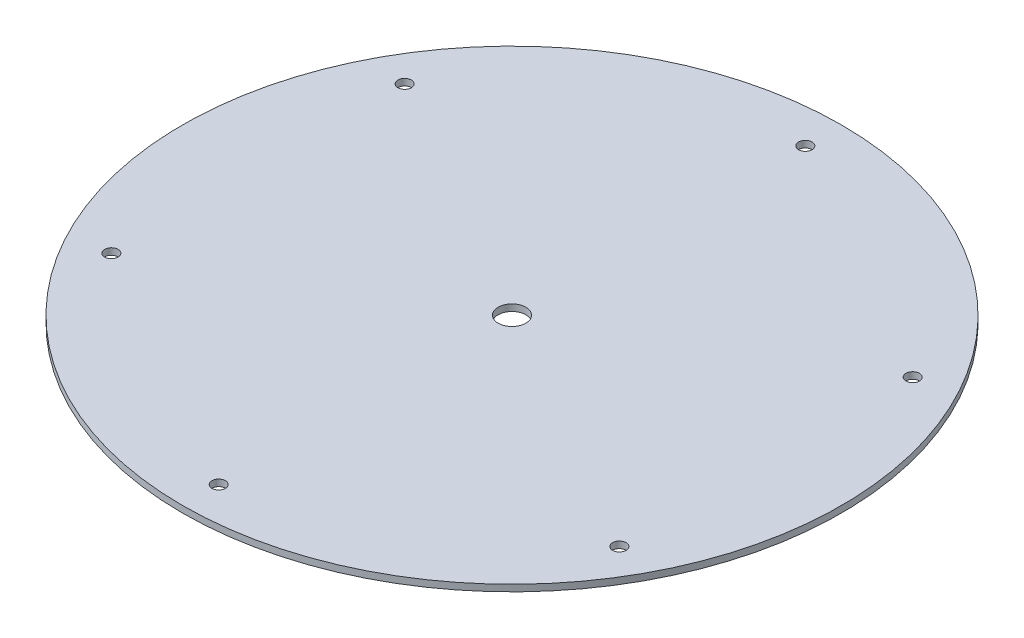
ISO-10303-21;
HEADER;
FILE_DESCRIPTION(('STEP AP214'),'2;1');
FILE_NAME('part.step','',(''),(''),'','','');
FILE_SCHEMA(('AUTOMOTIVE_DESIGN { 1 0 10303 214 1 1 1 1 }'));
ENDSEC;
DATA;
#1=APPLICATION_CONTEXT('core data for automotive mechanical design processes');
#2=APPLICATION_PROTOCOL_DEFINITION('international standard','automotive_design',2000,#1);
#3=PRODUCT_CONTEXT('',#1,'mechanical');
#4=PRODUCT('Part','Part','',(#3));
#5=PRODUCT_RELATED_PRODUCT_CATEGORY('part','',(#4));
#6=PRODUCT_DEFINITION_FORMATION('','',#4);
#7=PRODUCT_DEFINITION_CONTEXT('part definition',#1,'design');
#8=PRODUCT_DEFINITION('design','',#6,#7);
#9=PRODUCT_DEFINITION_SHAPE('','',#8);
#10=(LENGTH_UNIT() NAMED_UNIT(*) SI_UNIT(.MILLI.,.METRE.));
#11=(NAMED_UNIT(*) PLANE_ANGLE_UNIT() SI_UNIT($,.RADIAN.));
#12=(NAMED_UNIT(*) SI_UNIT($,.STERADIAN.) SOLID_ANGLE_UNIT());
#13=UNCERTAINTY_MEASURE_WITH_UNIT(LENGTH_MEASURE(1.E-05),#10,'distance_accuracy_value','');
#14=(GEOMETRIC_REPRESENTATION_CONTEXT(3) GLOBAL_UNCERTAINTY_ASSIGNED_CONTEXT((#13)) GLOBAL_UNIT_ASSIGNED_CONTEXT((#10,
#11,#12)) REPRESENTATION_CONTEXT('',''));
#15=CARTESIAN_POINT('',(0.,0.,0.));
#16=DIRECTION('',(0.,0.,1.));
#17=DIRECTION('',(1.,0.,0.));
#18=AXIS2_PLACEMENT_3D('',#15,#16,#17);
#19=CARTESIAN_POINT('',(0.,2.5,0.));
#20=DIRECTION('',(0.,1.,0.));
#21=DIRECTION('',(0.,0.,1.));
#22=AXIS2_PLACEMENT_3D('',#19,#20,#21);
#23=PLANE('',#22);
#24=CARTESIAN_POINT('',(-192.690652342028,2.5,-111.249999999994));
#25=DIRECTION('',(0.,1.,0.));
#26=DIRECTION('',(0.,0.,1.));
#27=AXIS2_PLACEMENT_3D('',#24,#25,#26);
#28=CIRCLE('',#27,5.09999999999998);
#29=CARTESIAN_POINT('',(-192.690652342028,2.5,-106.149999999994));
#30=VERTEX_POINT('',#29);
#31=EDGE_CURVE('E70',#30,#30,#28,.T.);
#32=ORIENTED_EDGE('',*,*,#31,.F.);
#33=EDGE_LOOP('',(#32));
#34=FACE_BOUND('',#33,.T.);
#35=CARTESIAN_POINT('',(1.90398786258418E-11,2.5,222.499999999989));
#36=DIRECTION('',(0.,1.,0.));
#37=DIRECTION('',(0.,0.,1.));
#38=AXIS2_PLACEMENT_3D('',#35,#36,#37);
#39=CIRCLE('',#38,5.1);
#40=CARTESIAN_POINT('',(1.90398786258418E-11,2.5,227.599999999989));
#41=VERTEX_POINT('',#40);
#42=EDGE_CURVE('E58',#41,#41,#39,.T.);
#43=ORIENTED_EDGE('',*,*,#42,.F.);
#44=EDGE_LOOP('',(#43));
#45=FACE_BOUND('',#44,.T.);
#46=CARTESIAN_POINT('',(192.690652342038,2.5,-111.250000000011));
#47=DIRECTION('',(0.,1.,0.));
#48=DIRECTION('',(0.,0.,1.));
#49=AXIS2_PLACEMENT_3D('',#46,#47,#48);
#50=CIRCLE('',#49,5.09999999999998);
#51=CARTESIAN_POINT('',(192.690652342038,2.5,-106.150000000011));
#52=VERTEX_POINT('',#51);
#53=EDGE_CURVE('E46',#52,#52,#50,.T.);
#54=ORIENTED_EDGE('',*,*,#53,.F.);
#55=EDGE_LOOP('',(#54));
#56=FACE_BOUND('',#55,.T.);
#57=CARTESIAN_POINT('',(0.,2.5,0.));
#58=DIRECTION('',(0.,1.,0.));
#59=DIRECTION('',(0.,0.,1.));
#60=AXIS2_PLACEMENT_3D('',#57,#58,#59);
#61=CIRCLE('',#60,250.);
#62=CARTESIAN_POINT('',(0.,2.5,250.));
#63=VERTEX_POINT('',#62);
#64=EDGE_CURVE('E10',#63,#63,#61,.T.);
#65=ORIENTED_EDGE('',*,*,#64,.T.);
#66=EDGE_LOOP('',(#65));
#67=FACE_BOUND('',#66,.T.);
#68=CARTESIAN_POINT('',(0.,2.5,-222.5));
#69=DIRECTION('',(0.,1.,0.));
#70=DIRECTION('',(0.,0.,1.));
#71=AXIS2_PLACEMENT_3D('',#68,#69,#70);
#72=CIRCLE('',#71,5.1);
#73=CARTESIAN_POINT('',(0.,2.5,-217.4));
#74=VERTEX_POINT('',#73);
#75=EDGE_CURVE('E41',#74,#74,#72,.T.);
#76=ORIENTED_EDGE('',*,*,#75,.F.);
#77=EDGE_LOOP('',(#76));
#78=FACE_BOUND('',#77,.T.);
#79=CARTESIAN_POINT('',(192.690652342047,2.5,111.249999999984));
#80=DIRECTION('',(0.,1.,0.));
#81=DIRECTION('',(0.,0.,1.));
#82=AXIS2_PLACEMENT_3D('',#79,#80,#81);
#83=CIRCLE('',#82,5.09999999999998);
#84=CARTESIAN_POINT('',(192.690652342047,2.5,116.349999999984));
#85=VERTEX_POINT('',#84);
#86=EDGE_CURVE('E52',#85,#85,#83,.T.);
#87=ORIENTED_EDGE('',*,*,#86,.F.);
#88=EDGE_LOOP('',(#87));
#89=FACE_BOUND('',#88,.T.);
#90=CARTESIAN_POINT('',(-192.690652342019,2.5,111.25));
#91=DIRECTION('',(0.,1.,0.));
#92=DIRECTION('',(0.,0.,1.));
#93=AXIS2_PLACEMENT_3D('',#90,#91,#92);
#94=CIRCLE('',#93,5.09999999999998);
#95=CARTESIAN_POINT('',(-192.690652342019,2.5,116.35));
#96=VERTEX_POINT('',#95);
#97=EDGE_CURVE('E64',#96,#96,#94,.T.);
#98=ORIENTED_EDGE('',*,*,#97,.F.);
#99=EDGE_LOOP('',(#98));
#100=FACE_BOUND('',#99,.T.);
#101=CARTESIAN_POINT('',(0.,2.5,0.));
#102=DIRECTION('',(0.,1.,0.));
#103=DIRECTION('',(0.,0.,1.));
#104=AXIS2_PLACEMENT_3D('',#101,#102,#103);
#105=CIRCLE('',#104,10.5);
#106=CARTESIAN_POINT('',(0.,2.5,10.5));
#107=VERTEX_POINT('',#106);
#108=EDGE_CURVE('E76',#107,#107,#105,.T.);
#109=ORIENTED_EDGE('',*,*,#108,.F.);
#110=EDGE_LOOP('',(#109));
#111=FACE_BOUND('',#110,.T.);
#112=ADVANCED_FACE('F30',(#34,#45,#56,#67,#78,#89,#100,#111),#23,.T.);
#113=CARTESIAN_POINT('',(0.,-2.5,0.));
#114=DIRECTION('',(0.,1.,0.));
#115=DIRECTION('',(0.,0.,1.));
#116=AXIS2_PLACEMENT_3D('',#113,#114,#115);
#117=PLANE('',#116);
#118=CARTESIAN_POINT('',(0.,-2.5,0.));
#119=DIRECTION('',(0.,1.,0.));
#120=DIRECTION('',(0.,0.,1.));
#121=AXIS2_PLACEMENT_3D('',#118,#119,#120);
#122=CIRCLE('',#121,250.);
#123=CARTESIAN_POINT('',(0.,-2.5,250.));
#124=VERTEX_POINT('',#123);
#125=EDGE_CURVE('E34',#124,#124,#122,.T.);
#126=ORIENTED_EDGE('',*,*,#125,.F.);
#127=EDGE_LOOP('',(#126));
#128=FACE_BOUND('',#127,.T.);
#129=CARTESIAN_POINT('',(0.,-2.5,-222.5));
#130=DIRECTION('',(0.,1.,0.));
#131=DIRECTION('',(0.,0.,1.));
#132=AXIS2_PLACEMENT_3D('',#129,#130,#131);
#133=CIRCLE('',#132,5.1);
#134=CARTESIAN_POINT('',(0.,-2.5,-217.4));
#135=VERTEX_POINT('',#134);
#136=EDGE_CURVE('E43',#135,#135,#133,.T.);
#137=ORIENTED_EDGE('',*,*,#136,.T.);
#138=EDGE_LOOP('',(#137));
#139=FACE_BOUND('',#138,.T.);
#140=CARTESIAN_POINT('',(192.690652342038,-2.5,-111.250000000011));
#141=DIRECTION('',(0.,1.,0.));
#142=DIRECTION('',(0.,0.,1.));
#143=AXIS2_PLACEMENT_3D('',#140,#141,#142);
#144=CIRCLE('',#143,5.09999999999998);
#145=CARTESIAN_POINT('',(192.690652342038,-2.5,-106.150000000011));
#146=VERTEX_POINT('',#145);
#147=EDGE_CURVE('E49',#146,#146,#144,.T.);
#148=ORIENTED_EDGE('',*,*,#147,.T.);
#149=EDGE_LOOP('',(#148));
#150=FACE_BOUND('',#149,.T.);
#151=CARTESIAN_POINT('',(192.690652342047,-2.5,111.249999999984));
#152=DIRECTION('',(0.,1.,0.));
#153=DIRECTION('',(0.,0.,1.));
#154=AXIS2_PLACEMENT_3D('',#151,#152,#153);
#155=CIRCLE('',#154,5.09999999999998);
#156=CARTESIAN_POINT('',(192.690652342047,-2.5,116.349999999984));
#157=VERTEX_POINT('',#156);
#158=EDGE_CURVE('E55',#157,#157,#155,.T.);
#159=ORIENTED_EDGE('',*,*,#158,.T.);
#160=EDGE_LOOP('',(#159));
#161=FACE_BOUND('',#160,.T.);
#162=CARTESIAN_POINT('',(1.90398786258418E-11,-2.5,222.499999999989));
#163=DIRECTION('',(0.,1.,0.));
#164=DIRECTION('',(0.,0.,1.));
#165=AXIS2_PLACEMENT_3D('',#162,#163,#164);
#166=CIRCLE('',#165,5.1);
#167=CARTESIAN_POINT('',(1.90398786258418E-11,-2.5,227.599999999989));
#168=VERTEX_POINT('',#167);
#169=EDGE_CURVE('E61',#168,#168,#166,.T.);
#170=ORIENTED_EDGE('',*,*,#169,.T.);
#171=EDGE_LOOP('',(#170));
#172=FACE_BOUND('',#171,.T.);
#173=CARTESIAN_POINT('',(-192.690652342019,-2.5,111.25));
#174=DIRECTION('',(0.,1.,0.));
#175=DIRECTION('',(0.,0.,1.));
#176=AXIS2_PLACEMENT_3D('',#173,#174,#175);
#177=CIRCLE('',#176,5.09999999999998);
#178=CARTESIAN_POINT('',(-192.690652342019,-2.5,116.35));
#179=VERTEX_POINT('',#178);
#180=EDGE_CURVE('E67',#179,#179,#177,.T.);
#181=ORIENTED_EDGE('',*,*,#180,.T.);
#182=EDGE_LOOP('',(#181));
#183=FACE_BOUND('',#182,.T.);
#184=CARTESIAN_POINT('',(-192.690652342028,-2.5,-111.249999999994));
#185=DIRECTION('',(0.,1.,0.));
#186=DIRECTION('',(0.,0.,1.));
#187=AXIS2_PLACEMENT_3D('',#184,#185,#186);
#188=CIRCLE('',#187,5.09999999999998);
#189=CARTESIAN_POINT('',(-192.690652342028,-2.5,-106.149999999994));
#190=VERTEX_POINT('',#189);
#191=EDGE_CURVE('E73',#190,#190,#188,.T.);
#192=ORIENTED_EDGE('',*,*,#191,.T.);
#193=EDGE_LOOP('',(#192));
#194=FACE_BOUND('',#193,.T.);
#195=CARTESIAN_POINT('',(0.,-2.5,0.));
#196=DIRECTION('',(0.,1.,0.));
#197=DIRECTION('',(0.,0.,1.));
#198=AXIS2_PLACEMENT_3D('',#195,#196,#197);
#199=CIRCLE('',#198,10.5);
#200=CARTESIAN_POINT('',(0.,-2.5,10.5));
#201=VERTEX_POINT('',#200);
#202=EDGE_CURVE('E79',#201,#201,#199,.T.);
#203=ORIENTED_EDGE('',*,*,#202,.T.);
#204=EDGE_LOOP('',(#203));
#205=FACE_BOUND('',#204,.T.);
#206=ADVANCED_FACE('F89',(#128,#139,#150,#161,#172,#183,#194,#205),#117,.F.);
#207=CARTESIAN_POINT('',(0.,2.5,0.));
#208=DIRECTION('',(0.,-1.,0.));
#209=DIRECTION('',(0.,0.,-1.));
#210=AXIS2_PLACEMENT_3D('',#207,#208,#209);
#211=CYLINDRICAL_SURFACE('',#210,250.);
#212=ORIENTED_EDGE('',*,*,#64,.F.);
#213=EDGE_LOOP('',(#212));
#214=FACE_BOUND('',#213,.T.);
#215=ORIENTED_EDGE('',*,*,#125,.T.);
#216=EDGE_LOOP('',(#215));
#217=FACE_BOUND('',#216,.T.);
#218=ADVANCED_FACE('F32',(#214,#217),#211,.T.);
#219=CARTESIAN_POINT('',(0.,2.5,-222.5));
#220=DIRECTION('',(0.,-1.,0.));
#221=DIRECTION('',(0.,0.,-1.));
#222=AXIS2_PLACEMENT_3D('',#219,#220,#221);
#223=CYLINDRICAL_SURFACE('',#222,5.1);
#224=ORIENTED_EDGE('',*,*,#75,.T.);
#225=EDGE_LOOP('',(#224));
#226=FACE_BOUND('',#225,.T.);
#227=ORIENTED_EDGE('',*,*,#136,.F.);
#228=EDGE_LOOP('',(#227));
#229=FACE_BOUND('',#228,.T.);
#230=ADVANCED_FACE('F99',(#226,#229),#223,.F.);
#231=CARTESIAN_POINT('',(192.690652342038,2.5,-111.250000000011));
#232=DIRECTION('',(0.,-1.,0.));
#233=DIRECTION('',(0.,0.,-1.));
#234=AXIS2_PLACEMENT_3D('',#231,#232,#233);
#235=CYLINDRICAL_SURFACE('',#234,5.09999999999998);
#236=ORIENTED_EDGE('',*,*,#53,.T.);
#237=EDGE_LOOP('',(#236));
#238=FACE_BOUND('',#237,.T.);
#239=ORIENTED_EDGE('',*,*,#147,.F.);
#240=EDGE_LOOP('',(#239));
#241=FACE_BOUND('',#240,.T.);
#242=ADVANCED_FACE('F102',(#238,#241),#235,.F.);
#243=CARTESIAN_POINT('',(192.690652342047,2.5,111.249999999984));
#244=DIRECTION('',(0.,-1.,0.));
#245=DIRECTION('',(0.,0.,-1.));
#246=AXIS2_PLACEMENT_3D('',#243,#244,#245);
#247=CYLINDRICAL_SURFACE('',#246,5.09999999999998);
#248=ORIENTED_EDGE('',*,*,#86,.T.);
#249=EDGE_LOOP('',(#248));
#250=FACE_BOUND('',#249,.T.);
#251=ORIENTED_EDGE('',*,*,#158,.F.);
#252=EDGE_LOOP('',(#251));
#253=FACE_BOUND('',#252,.T.);
#254=ADVANCED_FACE('F106',(#250,#253),#247,.F.);
#255=CARTESIAN_POINT('',(1.90398786258418E-11,2.5,222.499999999989));
#256=DIRECTION('',(0.,-1.,0.));
#257=DIRECTION('',(0.,0.,-1.));
#258=AXIS2_PLACEMENT_3D('',#255,#256,#257);
#259=CYLINDRICAL_SURFACE('',#258,5.1);
#260=ORIENTED_EDGE('',*,*,#42,.T.);
#261=EDGE_LOOP('',(#260));
#262=FACE_BOUND('',#261,.T.);
#263=ORIENTED_EDGE('',*,*,#169,.F.);
#264=EDGE_LOOP('',(#263));
#265=FACE_BOUND('',#264,.T.);
#266=ADVANCED_FACE('F110',(#262,#265),#259,.F.);
#267=CARTESIAN_POINT('',(-192.690652342019,2.5,111.25));
#268=DIRECTION('',(0.,-1.,0.));
#269=DIRECTION('',(0.,0.,-1.));
#270=AXIS2_PLACEMENT_3D('',#267,#268,#269);
#271=CYLINDRICAL_SURFACE('',#270,5.09999999999998);
#272=ORIENTED_EDGE('',*,*,#97,.T.);
#273=EDGE_LOOP('',(#272));
#274=FACE_BOUND('',#273,.T.);
#275=ORIENTED_EDGE('',*,*,#180,.F.);
#276=EDGE_LOOP('',(#275));
#277=FACE_BOUND('',#276,.T.);
#278=ADVANCED_FACE('F114',(#274,#277),#271,.F.);
#279=CARTESIAN_POINT('',(-192.690652342028,2.5,-111.249999999994));
#280=DIRECTION('',(0.,-1.,0.));
#281=DIRECTION('',(0.,0.,-1.));
#282=AXIS2_PLACEMENT_3D('',#279,#280,#281);
#283=CYLINDRICAL_SURFACE('',#282,5.09999999999998);
#284=ORIENTED_EDGE('',*,*,#31,.T.);
#285=EDGE_LOOP('',(#284));
#286=FACE_BOUND('',#285,.T.);
#287=ORIENTED_EDGE('',*,*,#191,.F.);
#288=EDGE_LOOP('',(#287));
#289=FACE_BOUND('',#288,.T.);
#290=ADVANCED_FACE('F118',(#286,#289),#283,.F.);
#291=CARTESIAN_POINT('',(0.,2.5,0.));
#292=DIRECTION('',(0.,-1.,0.));
#293=DIRECTION('',(0.,0.,-1.));
#294=AXIS2_PLACEMENT_3D('',#291,#292,#293);
#295=CYLINDRICAL_SURFACE('',#294,10.5);
#296=ORIENTED_EDGE('',*,*,#108,.T.);
#297=EDGE_LOOP('',(#296));
#298=FACE_BOUND('',#297,.T.);
#299=ORIENTED_EDGE('',*,*,#202,.F.);
#300=EDGE_LOOP('',(#299));
#301=FACE_BOUND('',#300,.T.);
#302=ADVANCED_FACE('F85',(#298,#301),#295,.F.);
#303=CLOSED_SHELL('',(#112,#206,#218,#230,#242,#254,#266,#278,#290,#302));
#304=MANIFOLD_SOLID_BREP('B2',#303);
#305=ADVANCED_BREP_SHAPE_REPRESENTATION('',(#18,#304),#14);
#306=SHAPE_DEFINITION_REPRESENTATION(#9,#305);
ENDSEC;
END-ISO-10303-21;
